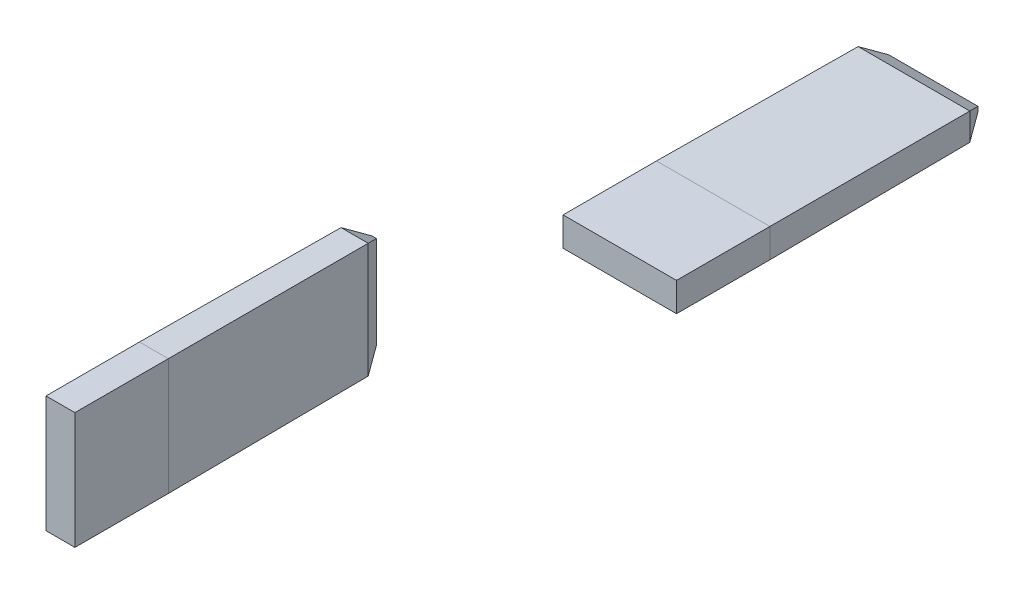
ISO-10303-21;
HEADER;
FILE_DESCRIPTION(('STEP AP214'),'2;1');
FILE_NAME('part.step','',(''),(''),'','','');
FILE_SCHEMA(('AUTOMOTIVE_DESIGN { 1 0 10303 214 1 1 1 1 }'));
ENDSEC;
DATA;
#1=APPLICATION_CONTEXT('core data for automotive mechanical design processes');
#2=APPLICATION_PROTOCOL_DEFINITION('international standard','automotive_design',2000,#1);
#3=PRODUCT_CONTEXT('',#1,'mechanical');
#4=PRODUCT('Part','Part','',(#3));
#5=PRODUCT_RELATED_PRODUCT_CATEGORY('part','',(#4));
#6=PRODUCT_DEFINITION_FORMATION('','',#4);
#7=PRODUCT_DEFINITION_CONTEXT('part definition',#1,'design');
#8=PRODUCT_DEFINITION('design','',#6,#7);
#9=PRODUCT_DEFINITION_SHAPE('','',#8);
#10=(LENGTH_UNIT() NAMED_UNIT(*) SI_UNIT(.MILLI.,.METRE.));
#11=(NAMED_UNIT(*) PLANE_ANGLE_UNIT() SI_UNIT($,.RADIAN.));
#12=(NAMED_UNIT(*) SI_UNIT($,.STERADIAN.) SOLID_ANGLE_UNIT());
#13=UNCERTAINTY_MEASURE_WITH_UNIT(LENGTH_MEASURE(1.E-05),#10,'distance_accuracy_value','');
#14=(GEOMETRIC_REPRESENTATION_CONTEXT(3) GLOBAL_UNCERTAINTY_ASSIGNED_CONTEXT((#13)) GLOBAL_UNIT_ASSIGNED_CONTEXT((#10,
#11,#12)) REPRESENTATION_CONTEXT('',''));
#15=CARTESIAN_POINT('',(0.,0.,0.));
#16=DIRECTION('',(0.,0.,1.));
#17=DIRECTION('',(1.,0.,0.));
#18=AXIS2_PLACEMENT_3D('',#15,#16,#17);
#19=CARTESIAN_POINT('',(0.,39.9999999999999,-9.99999999999999));
#20=DIRECTION('',(0.,-1.,0.));
#21=DIRECTION('',(0.,0.,-1.));
#22=AXIS2_PLACEMENT_3D('',#19,#20,#21);
#23=PLANE('',#22);
#24=DIRECTION('',(1.,0.,0.));
#25=VECTOR('',#24,1.);
#26=CARTESIAN_POINT('',(0.,39.9999999999999,-1.59999999999999));
#27=LINE('',#26,#25);
#28=CARTESIAN_POINT('',(-247.95,39.9999999999999,-1.59999999999999));
#29=VERTEX_POINT('',#28);
#30=CARTESIAN_POINT('',(-237.75,39.9999999999999,-1.59999999999999));
#31=VERTEX_POINT('',#30);
#32=EDGE_CURVE('E156',#29,#31,#27,.T.);
#33=ORIENTED_EDGE('',*,*,#32,.F.);
#34=DIRECTION('',(0.,0.,1.));
#35=VECTOR('',#34,1.);
#36=CARTESIAN_POINT('',(-247.95,39.9999999999999,-9.99999999999999));
#37=LINE('',#36,#35);
#38=CARTESIAN_POINT('',(-247.95,39.9999999999999,-9.99999999999999));
#39=VERTEX_POINT('',#38);
#40=EDGE_CURVE('E142',#39,#29,#37,.T.);
#41=ORIENTED_EDGE('',*,*,#40,.F.);
#42=DIRECTION('',(1.,0.,0.));
#43=VECTOR('',#42,1.);
#44=CARTESIAN_POINT('',(0.,39.9999999999999,-9.99999999999999));
#45=LINE('',#44,#43);
#46=CARTESIAN_POINT('',(-237.75,39.9999999999999,-9.99999999999999));
#47=VERTEX_POINT('',#46);
#48=EDGE_CURVE('E117',#39,#47,#45,.T.);
#49=ORIENTED_EDGE('',*,*,#48,.T.);
#50=DIRECTION('',(0.,0.,1.));
#51=VECTOR('',#50,1.);
#52=CARTESIAN_POINT('',(-237.75,39.9999999999999,-9.99999999999999));
#53=LINE('',#52,#51);
#54=EDGE_CURVE('E132',#47,#31,#53,.T.);
#55=ORIENTED_EDGE('',*,*,#54,.T.);
#56=EDGE_LOOP('',(#33,#41,#49,#55));
#57=FACE_BOUND('',#56,.T.);
#58=ADVANCED_FACE('F45',(#57),#23,.T.);
#59=CARTESIAN_POINT('',(-247.95,3.12500000000002,-9.99999999999999));
#60=DIRECTION('',(-1.,0.,0.));
#61=DIRECTION('',(0.,0.,1.));
#62=AXIS2_PLACEMENT_3D('',#59,#60,#61);
#63=PLANE('',#62);
#64=DIRECTION('',(0.,-1.,0.));
#65=VECTOR('',#64,1.);
#66=CARTESIAN_POINT('',(-247.95,3.12500000000002,-1.59999999999999));
#67=LINE('',#66,#65);
#68=CARTESIAN_POINT('',(-247.95,42.5999999999999,-1.59999999999999));
#69=VERTEX_POINT('',#68);
#70=EDGE_CURVE('E144',#69,#29,#67,.T.);
#71=ORIENTED_EDGE('',*,*,#70,.F.);
#72=DIRECTION('',(0.,0.,1.));
#73=VECTOR('',#72,1.);
#74=CARTESIAN_POINT('',(-247.95,42.5999999999999,-9.99999999999999));
#75=LINE('',#74,#73);
#76=CARTESIAN_POINT('',(-247.95,42.5999999999999,-9.99999999999999));
#77=VERTEX_POINT('',#76);
#78=EDGE_CURVE('E163',#77,#69,#75,.T.);
#79=ORIENTED_EDGE('',*,*,#78,.F.);
#80=DIRECTION('',(0.,-1.,0.));
#81=VECTOR('',#80,1.);
#82=CARTESIAN_POINT('',(-247.95,3.12500000000002,-9.99999999999999));
#83=LINE('',#82,#81);
#84=EDGE_CURVE('E140',#77,#39,#83,.T.);
#85=ORIENTED_EDGE('',*,*,#84,.T.);
#86=ORIENTED_EDGE('',*,*,#40,.T.);
#87=EDGE_LOOP('',(#71,#79,#85,#86));
#88=FACE_BOUND('',#87,.T.);
#89=ADVANCED_FACE('F211',(#88),#63,.T.);
#90=CARTESIAN_POINT('',(0.,42.5999999999999,-9.99999999999999));
#91=DIRECTION('',(0.,1.,0.));
#92=DIRECTION('',(0.,0.,1.));
#93=AXIS2_PLACEMENT_3D('',#90,#91,#92);
#94=PLANE('',#93);
#95=DIRECTION('',(-1.,0.,0.));
#96=VECTOR('',#95,1.);
#97=CARTESIAN_POINT('',(0.,42.5999999999999,-1.59999999999999));
#98=LINE('',#97,#96);
#99=CARTESIAN_POINT('',(-237.75,42.5999999999999,-1.59999999999999));
#100=VERTEX_POINT('',#99);
#101=EDGE_CURVE('E147',#100,#69,#98,.T.);
#102=ORIENTED_EDGE('',*,*,#101,.F.);
#103=DIRECTION('',(0.,0.,1.));
#104=VECTOR('',#103,1.);
#105=CARTESIAN_POINT('',(-237.75,42.5999999999999,-9.99999999999999));
#106=LINE('',#105,#104);
#107=CARTESIAN_POINT('',(-237.75,42.5999999999999,-9.99999999999999));
#108=VERTEX_POINT('',#107);
#109=EDGE_CURVE('E139',#108,#100,#106,.T.);
#110=ORIENTED_EDGE('',*,*,#109,.F.);
#111=DIRECTION('',(-1.,0.,0.));
#112=VECTOR('',#111,1.);
#113=CARTESIAN_POINT('',(0.,42.5999999999999,-9.99999999999999));
#114=LINE('',#113,#112);
#115=EDGE_CURVE('E129',#108,#77,#114,.T.);
#116=ORIENTED_EDGE('',*,*,#115,.T.);
#117=ORIENTED_EDGE('',*,*,#78,.T.);
#118=EDGE_LOOP('',(#102,#110,#116,#117));
#119=FACE_BOUND('',#118,.T.);
#120=ADVANCED_FACE('F216',(#119),#94,.T.);
#121=CARTESIAN_POINT('',(-237.75,3.12500000000002,-9.99999999999999));
#122=DIRECTION('',(1.,0.,0.));
#123=DIRECTION('',(0.,0.,-1.));
#124=AXIS2_PLACEMENT_3D('',#121,#122,#123);
#125=PLANE('',#124);
#126=DIRECTION('',(0.,1.,0.));
#127=VECTOR('',#126,1.);
#128=CARTESIAN_POINT('',(-237.75,3.12500000000002,-1.59999999999999));
#129=LINE('',#128,#127);
#130=EDGE_CURVE('E135',#31,#100,#129,.T.);
#131=ORIENTED_EDGE('',*,*,#130,.F.);
#132=ORIENTED_EDGE('',*,*,#54,.F.);
#133=DIRECTION('',(0.,1.,0.));
#134=VECTOR('',#133,1.);
#135=CARTESIAN_POINT('',(-237.75,3.12500000000002,-9.99999999999999));
#136=LINE('',#135,#134);
#137=EDGE_CURVE('E124',#47,#108,#136,.T.);
#138=ORIENTED_EDGE('',*,*,#137,.T.);
#139=ORIENTED_EDGE('',*,*,#109,.T.);
#140=EDGE_LOOP('',(#131,#132,#138,#139));
#141=FACE_BOUND('',#140,.T.);
#142=ADVANCED_FACE('F133',(#141),#125,.T.);
#143=CARTESIAN_POINT('',(0.,0.,-1.59999999999999));
#144=DIRECTION('',(0.,0.,1.));
#145=DIRECTION('',(0.,-1.,0.));
#146=AXIS2_PLACEMENT_3D('',#143,#144,#145);
#147=PLANE('',#146);
#148=ORIENTED_EDGE('',*,*,#32,.T.);
#149=ORIENTED_EDGE('',*,*,#130,.T.);
#150=ORIENTED_EDGE('',*,*,#101,.T.);
#151=ORIENTED_EDGE('',*,*,#70,.T.);
#152=EDGE_LOOP('',(#148,#149,#150,#151));
#153=FACE_BOUND('',#152,.T.);
#154=ADVANCED_FACE('F232',(#153),#147,.T.);
#155=CARTESIAN_POINT('',(-237.75,0.,-9.99999999999999));
#156=DIRECTION('',(0.999990480720734,0.,-0.00436330928474658));
#157=DIRECTION('',(-0.00436330928474658,0.,-0.999990480720734));
#158=AXIS2_PLACEMENT_3D('',#155,#156,#157);
#159=PLANE('',#158);
#160=DIRECTION('',(0.00436326774997774,-0.00436326774997774,0.999980961713314));
#161=VECTOR('',#160,1.);
#162=CARTESIAN_POINT('',(-237.745473690427,39.9954736904273,-8.96265284213137));
#163=LINE('',#162,#161);
#164=CARTESIAN_POINT('',(-237.828779249498,40.0787792494983,-28.0547594579531));
#165=VERTEX_POINT('',#164);
#166=EDGE_CURVE('E112',#165,#47,#163,.T.);
#167=ORIENTED_EDGE('',*,*,#166,.F.);
#168=DIRECTION('',(0.,1.,0.));
#169=VECTOR('',#168,1.);
#170=CARTESIAN_POINT('',(-237.828779249498,0.,-28.0547594579531));
#171=LINE('',#170,#169);
#172=CARTESIAN_POINT('',(-237.828779249498,42.5212207505015,-28.0547594579531));
#173=VERTEX_POINT('',#172);
#174=EDGE_CURVE('E70',#165,#173,#171,.T.);
#175=ORIENTED_EDGE('',*,*,#174,.T.);
#176=DIRECTION('',(0.00436326774997774,0.00436326774997774,0.999980961713314));
#177=VECTOR('',#176,1.);
#178=CARTESIAN_POINT('',(-237.750811023292,42.5991889767074,-10.1858716674036));
#179=LINE('',#178,#177);
#180=EDGE_CURVE('E121',#173,#108,#179,.T.);
#181=ORIENTED_EDGE('',*,*,#180,.T.);
#182=ORIENTED_EDGE('',*,*,#137,.F.);
#183=EDGE_LOOP('',(#167,#175,#181,#182));
#184=FACE_BOUND('',#183,.T.);
#185=ADVANCED_FACE('F126',(#184),#159,.T.);
#186=CARTESIAN_POINT('',(0.,42.5999999999999,-9.99999999999999));
#187=DIRECTION('',(0.,0.999990480720734,-0.00436330928474658));
#188=DIRECTION('',(0.,0.00436330928474658,0.999990480720734));
#189=AXIS2_PLACEMENT_3D('',#186,#187,#188);
#190=PLANE('',#189);
#191=ORIENTED_EDGE('',*,*,#180,.F.);
#192=DIRECTION('',(-1.,0.,0.));
#193=VECTOR('',#192,1.);
#194=CARTESIAN_POINT('',(0.,42.5212207505015,-28.0547594579531));
#195=LINE('',#194,#193);
#196=CARTESIAN_POINT('',(-247.871220750501,42.5212207505015,-28.0547594579531));
#197=VERTEX_POINT('',#196);
#198=EDGE_CURVE('E55',#173,#197,#195,.T.);
#199=ORIENTED_EDGE('',*,*,#198,.T.);
#200=DIRECTION('',(-0.00436326774997774,0.00436326774997774,0.999980961713314));
#201=VECTOR('',#200,1.);
#202=CARTESIAN_POINT('',(-247.945279501751,42.5952795017516,-11.0818516416131));
#203=LINE('',#202,#201);
#204=EDGE_CURVE('E150',#197,#77,#203,.T.);
#205=ORIENTED_EDGE('',*,*,#204,.T.);
#206=ORIENTED_EDGE('',*,*,#115,.F.);
#207=EDGE_LOOP('',(#191,#199,#205,#206));
#208=FACE_BOUND('',#207,.T.);
#209=ADVANCED_FACE('F242',(#208),#190,.T.);
#210=CARTESIAN_POINT('',(-247.95,0.,-9.99999999999999));
#211=DIRECTION('',(-0.999990480720734,0.,-0.00436330928474658));
#212=DIRECTION('',(-0.00436330928474658,0.,0.999990480720734));
#213=AXIS2_PLACEMENT_3D('',#210,#211,#212);
#214=PLANE('',#213);
#215=ORIENTED_EDGE('',*,*,#204,.F.);
#216=DIRECTION('',(0.,-1.,0.));
#217=VECTOR('',#216,1.);
#218=CARTESIAN_POINT('',(-247.871220750501,0.,-28.0547594579531));
#219=LINE('',#218,#217);
#220=CARTESIAN_POINT('',(-247.871220750501,40.0787792494983,-28.0547594579531));
#221=VERTEX_POINT('',#220);
#222=EDGE_CURVE('E12',#197,#221,#219,.T.);
#223=ORIENTED_EDGE('',*,*,#222,.T.);
#224=DIRECTION('',(-0.00436326774997774,-0.00436326774997774,0.999980961713314));
#225=VECTOR('',#224,1.);
#226=CARTESIAN_POINT('',(-247.950761524218,39.9992384757816,-9.82547261276658));
#227=LINE('',#226,#225);
#228=EDGE_CURVE('E158',#221,#39,#227,.T.);
#229=ORIENTED_EDGE('',*,*,#228,.T.);
#230=ORIENTED_EDGE('',*,*,#84,.F.);
#231=EDGE_LOOP('',(#215,#223,#229,#230));
#232=FACE_BOUND('',#231,.T.);
#233=ADVANCED_FACE('F239',(#232),#214,.T.);
#234=CARTESIAN_POINT('',(0.,39.9999999999999,-9.99999999999999));
#235=DIRECTION('',(0.,-0.999990480720734,-0.00436330928474658));
#236=DIRECTION('',(0.,0.00436330928474658,-0.999990480720734));
#237=AXIS2_PLACEMENT_3D('',#234,#235,#236);
#238=PLANE('',#237);
#239=ORIENTED_EDGE('',*,*,#228,.F.);
#240=DIRECTION('',(1.,0.,0.));
#241=VECTOR('',#240,1.);
#242=CARTESIAN_POINT('',(0.,40.0787792494983,-28.0547594579531));
#243=LINE('',#242,#241);
#244=EDGE_CURVE('E120',#221,#165,#243,.T.);
#245=ORIENTED_EDGE('',*,*,#244,.T.);
#246=ORIENTED_EDGE('',*,*,#166,.T.);
#247=ORIENTED_EDGE('',*,*,#48,.F.);
#248=EDGE_LOOP('',(#239,#245,#246,#247));
#249=FACE_BOUND('',#248,.T.);
#250=ADVANCED_FACE('F115',(#249),#238,.T.);
#251=CARTESIAN_POINT('',(-248.45,47.9999999999999,-29.8));
#252=DIRECTION('',(0.,0.,-1.));
#253=DIRECTION('',(0.,-1.,0.));
#254=AXIS2_PLACEMENT_3D('',#251,#252,#253);
#255=PLANE('',#254);
#256=DIRECTION('',(0.,-1.,0.));
#257=VECTOR('',#256,1.);
#258=CARTESIAN_POINT('',(-238.83639434625,47.9999999999999,-29.8));
#259=LINE('',#258,#257);
#260=CARTESIAN_POINT('',(-238.83639434625,41.51360565375,-29.8));
#261=VERTEX_POINT('',#260);
#262=CARTESIAN_POINT('',(-238.83639434625,41.0863943462498,-29.8));
#263=VERTEX_POINT('',#262);
#264=EDGE_CURVE('E171',#261,#263,#259,.T.);
#265=ORIENTED_EDGE('',*,*,#264,.T.);
#266=DIRECTION('',(-1.,0.,0.));
#267=VECTOR('',#266,1.);
#268=CARTESIAN_POINT('',(-248.45,41.0863943462498,-29.8));
#269=LINE('',#268,#267);
#270=CARTESIAN_POINT('',(-246.86360565375,41.0863943462498,-29.8));
#271=VERTEX_POINT('',#270);
#272=EDGE_CURVE('E173',#263,#271,#269,.T.);
#273=ORIENTED_EDGE('',*,*,#272,.T.);
#274=DIRECTION('',(0.,1.,0.));
#275=VECTOR('',#274,1.);
#276=CARTESIAN_POINT('',(-246.86360565375,47.9999999999999,-29.8));
#277=LINE('',#276,#275);
#278=CARTESIAN_POINT('',(-246.86360565375,41.51360565375,-29.8));
#279=VERTEX_POINT('',#278);
#280=EDGE_CURVE('E167',#271,#279,#277,.T.);
#281=ORIENTED_EDGE('',*,*,#280,.T.);
#282=DIRECTION('',(1.,0.,0.));
#283=VECTOR('',#282,1.);
#284=CARTESIAN_POINT('',(-248.45,41.51360565375,-29.8));
#285=LINE('',#284,#283);
#286=EDGE_CURVE('E169',#279,#261,#285,.T.);
#287=ORIENTED_EDGE('',*,*,#286,.T.);
#288=EDGE_LOOP('',(#265,#273,#281,#287));
#289=FACE_BOUND('',#288,.T.);
#290=ADVANCED_FACE('F196',(#289),#255,.T.);
#291=CARTESIAN_POINT('',(0.,42.5212207505015,-28.0547594579531));
#292=DIRECTION('',(0.,-0.866025403784435,0.500000000000007));
#293=DIRECTION('',(-1.,0.,0.));
#294=AXIS2_PLACEMENT_3D('',#291,#292,#293);
#295=PLANE('',#294);
#296=DIRECTION('',(-0.447213595499963,-0.447213595499963,-0.774596669241478));
#297=VECTOR('',#296,1.);
#298=CARTESIAN_POINT('',(-190.263023399597,90.0869766004021,54.33154637449));
#299=LINE('',#298,#297);
#300=EDGE_CURVE('E181',#261,#173,#299,.F.);
#301=ORIENTED_EDGE('',*,*,#300,.F.);
#302=ORIENTED_EDGE('',*,*,#286,.F.);
#303=DIRECTION('',(0.447213595499963,-0.447213595499963,-0.774596669241478));
#304=VECTOR('',#303,1.);
#305=CARTESIAN_POINT('',(-239.366976600401,34.016976600401,-42.7845424058972));
#306=LINE('',#305,#304);
#307=EDGE_CURVE('E50',#197,#279,#306,.T.);
#308=ORIENTED_EDGE('',*,*,#307,.F.);
#309=ORIENTED_EDGE('',*,*,#198,.F.);
#310=EDGE_LOOP('',(#301,#302,#308,#309));
#311=FACE_BOUND('',#310,.T.);
#312=ADVANCED_FACE('F48',(#311),#295,.F.);
#313=CARTESIAN_POINT('',(-247.871220750501,0.,-28.0547594579531));
#314=DIRECTION('',(0.866025403784435,0.,0.500000000000007));
#315=DIRECTION('',(0.,-1.,0.));
#316=AXIS2_PLACEMENT_3D('',#313,#314,#315);
#317=PLANE('',#316);
#318=ORIENTED_EDGE('',*,*,#307,.T.);
#319=ORIENTED_EDGE('',*,*,#280,.F.);
#320=DIRECTION('',(-0.447213595499963,-0.447213595499963,0.774596669241478));
#321=VECTOR('',#320,1.);
#322=CARTESIAN_POINT('',(-255.886976600401,32.0630233995985,-14.1710630648594));
#323=LINE('',#322,#321);
#324=EDGE_CURVE('E180',#221,#271,#323,.F.);
#325=ORIENTED_EDGE('',*,*,#324,.F.);
#326=ORIENTED_EDGE('',*,*,#222,.F.);
#327=EDGE_LOOP('',(#318,#319,#325,#326));
#328=FACE_BOUND('',#327,.T.);
#329=ADVANCED_FACE('F191',(#328),#317,.F.);
#330=CARTESIAN_POINT('',(-237.828779249498,0.,-28.0547594579531));
#331=DIRECTION('',(-0.866025403784435,0.,0.500000000000007));
#332=DIRECTION('',(0.,1.,0.));
#333=AXIS2_PLACEMENT_3D('',#330,#331,#332);
#334=PLANE('',#333);
#335=ORIENTED_EDGE('',*,*,#300,.T.);
#336=ORIENTED_EDGE('',*,*,#174,.F.);
#337=DIRECTION('',(-0.447213595499963,0.447213595499963,-0.774596669241478));
#338=VECTOR('',#337,1.);
#339=CARTESIAN_POINT('',(-229.813023399598,32.0630233995985,-14.1710630648594));
#340=LINE('',#339,#338);
#341=EDGE_CURVE('E178',#263,#165,#340,.F.);
#342=ORIENTED_EDGE('',*,*,#341,.F.);
#343=ORIENTED_EDGE('',*,*,#264,.F.);
#344=EDGE_LOOP('',(#335,#336,#342,#343));
#345=FACE_BOUND('',#344,.T.);
#346=ADVANCED_FACE('F201',(#345),#334,.F.);
#347=CARTESIAN_POINT('',(0.,40.0787792494983,-28.0547594579531));
#348=DIRECTION('',(0.,0.866025403784435,0.500000000000007));
#349=DIRECTION('',(1.,0.,0.));
#350=AXIS2_PLACEMENT_3D('',#347,#348,#349);
#351=PLANE('',#350);
#352=ORIENTED_EDGE('',*,*,#324,.T.);
#353=ORIENTED_EDGE('',*,*,#272,.F.);
#354=ORIENTED_EDGE('',*,*,#341,.T.);
#355=ORIENTED_EDGE('',*,*,#244,.F.);
#356=EDGE_LOOP('',(#352,#353,#354,#355));
#357=FACE_BOUND('',#356,.T.);
#358=ADVANCED_FACE('F200',(#357),#351,.F.);
#359=CLOSED_SHELL('',(#58,#89,#120,#142,#154,#185,#209,#233,#250,#290,#312,#329,#346,#358));
#360=MANIFOLD_SOLID_BREP('B2',#359);
#361=CARTESIAN_POINT('',(-294.45,3.12500000000002,-9.99999999999999));
#362=DIRECTION('',(-1.,0.,0.));
#363=DIRECTION('',(0.,0.,1.));
#364=AXIS2_PLACEMENT_3D('',#361,#362,#363);
#365=PLANE('',#364);
#366=DIRECTION('',(0.,-1.,0.));
#367=VECTOR('',#366,1.);
#368=CARTESIAN_POINT('',(-294.45,3.12500000000002,-1.59999999999999));
#369=LINE('',#368,#367);
#370=CARTESIAN_POINT('',(-294.45,5.25,-1.59999999999999));
#371=VERTEX_POINT('',#370);
#372=CARTESIAN_POINT('',(-294.45,-5.25,-1.59999999999999));
#373=VERTEX_POINT('',#372);
#374=EDGE_CURVE('E430',#371,#373,#369,.T.);
#375=ORIENTED_EDGE('',*,*,#374,.F.);
#376=DIRECTION('',(0.,0.,1.));
#377=VECTOR('',#376,1.);
#378=CARTESIAN_POINT('',(-294.45,5.25,-9.99999999999999));
#379=LINE('',#378,#377);
#380=CARTESIAN_POINT('',(-294.45,5.25,-9.99999999999999));
#381=VERTEX_POINT('',#380);
#382=EDGE_CURVE('E428',#381,#371,#379,.T.);
#383=ORIENTED_EDGE('',*,*,#382,.F.);
#384=DIRECTION('',(0.,-1.,0.));
#385=VECTOR('',#384,1.);
#386=CARTESIAN_POINT('',(-294.45,3.12500000000002,-9.99999999999999));
#387=LINE('',#386,#385);
#388=CARTESIAN_POINT('',(-294.45,-5.25,-9.99999999999999));
#389=VERTEX_POINT('',#388);
#390=EDGE_CURVE('E418',#381,#389,#387,.T.);
#391=ORIENTED_EDGE('',*,*,#390,.T.);
#392=DIRECTION('',(0.,0.,1.));
#393=VECTOR('',#392,1.);
#394=CARTESIAN_POINT('',(-294.45,-5.25,-9.99999999999999));
#395=LINE('',#394,#393);
#396=EDGE_CURVE('E439',#389,#373,#395,.T.);
#397=ORIENTED_EDGE('',*,*,#396,.T.);
#398=EDGE_LOOP('',(#375,#383,#391,#397));
#399=FACE_BOUND('',#398,.T.);
#400=ADVANCED_FACE('F341',(#399),#365,.T.);
#401=CARTESIAN_POINT('',(0.,5.25,-9.99999999999999));
#402=DIRECTION('',(0.,1.,0.));
#403=DIRECTION('',(0.,0.,1.));
#404=AXIS2_PLACEMENT_3D('',#401,#402,#403);
#405=PLANE('',#404);
#406=DIRECTION('',(-1.,0.,0.));
#407=VECTOR('',#406,1.);
#408=CARTESIAN_POINT('',(0.,5.25,-1.59999999999999));
#409=LINE('',#408,#407);
#410=CARTESIAN_POINT('',(-291.85,5.25,-1.59999999999999));
#411=VERTEX_POINT('',#410);
#412=EDGE_CURVE('E425',#411,#371,#409,.T.);
#413=ORIENTED_EDGE('',*,*,#412,.F.);
#414=DIRECTION('',(0.,0.,1.));
#415=VECTOR('',#414,1.);
#416=CARTESIAN_POINT('',(-291.85,5.25,-9.99999999999999));
#417=LINE('',#416,#415);
#418=CARTESIAN_POINT('',(-291.85,5.25,-9.99999999999999));
#419=VERTEX_POINT('',#418);
#420=EDGE_CURVE('E435',#419,#411,#417,.T.);
#421=ORIENTED_EDGE('',*,*,#420,.F.);
#422=DIRECTION('',(-1.,0.,0.));
#423=VECTOR('',#422,1.);
#424=CARTESIAN_POINT('',(0.,5.25,-9.99999999999999));
#425=LINE('',#424,#423);
#426=EDGE_CURVE('E410',#419,#381,#425,.T.);
#427=ORIENTED_EDGE('',*,*,#426,.T.);
#428=ORIENTED_EDGE('',*,*,#382,.T.);
#429=EDGE_LOOP('',(#413,#421,#427,#428));
#430=FACE_BOUND('',#429,.T.);
#431=ADVANCED_FACE('F437',(#430),#405,.T.);
#432=CARTESIAN_POINT('',(-291.85,3.12500000000002,-9.99999999999999));
#433=DIRECTION('',(1.,0.,0.));
#434=DIRECTION('',(0.,0.,-1.));
#435=AXIS2_PLACEMENT_3D('',#432,#433,#434);
#436=PLANE('',#435);
#437=DIRECTION('',(0.,1.,0.));
#438=VECTOR('',#437,1.);
#439=CARTESIAN_POINT('',(-291.85,3.12500000000002,-1.59999999999999));
#440=LINE('',#439,#438);
#441=CARTESIAN_POINT('',(-291.85,-5.25,-1.59999999999999));
#442=VERTEX_POINT('',#441);
#443=EDGE_CURVE('E451',#442,#411,#440,.T.);
#444=ORIENTED_EDGE('',*,*,#443,.F.);
#445=DIRECTION('',(0.,0.,1.));
#446=VECTOR('',#445,1.);
#447=CARTESIAN_POINT('',(-291.85,-5.25,-9.99999999999999));
#448=LINE('',#447,#446);
#449=CARTESIAN_POINT('',(-291.85,-5.25,-9.99999999999999));
#450=VERTEX_POINT('',#449);
#451=EDGE_CURVE('E442',#450,#442,#448,.T.);
#452=ORIENTED_EDGE('',*,*,#451,.F.);
#453=DIRECTION('',(0.,1.,0.));
#454=VECTOR('',#453,1.);
#455=CARTESIAN_POINT('',(-291.85,3.12500000000002,-9.99999999999999));
#456=LINE('',#455,#454);
#457=EDGE_CURVE('E440',#450,#419,#456,.T.);
#458=ORIENTED_EDGE('',*,*,#457,.T.);
#459=ORIENTED_EDGE('',*,*,#420,.T.);
#460=EDGE_LOOP('',(#444,#452,#458,#459));
#461=FACE_BOUND('',#460,.T.);
#462=ADVANCED_FACE('F517',(#461),#436,.T.);
#463=CARTESIAN_POINT('',(0.,-5.25,-9.99999999999999));
#464=DIRECTION('',(0.,-1.,0.));
#465=DIRECTION('',(0.,0.,-1.));
#466=AXIS2_PLACEMENT_3D('',#463,#464,#465);
#467=PLANE('',#466);
#468=DIRECTION('',(1.,0.,0.));
#469=VECTOR('',#468,1.);
#470=CARTESIAN_POINT('',(0.,-5.25,-1.59999999999999));
#471=LINE('',#470,#469);
#472=EDGE_CURVE('E448',#373,#442,#471,.T.);
#473=ORIENTED_EDGE('',*,*,#472,.F.);
#474=ORIENTED_EDGE('',*,*,#396,.F.);
#475=DIRECTION('',(1.,0.,0.));
#476=VECTOR('',#475,1.);
#477=CARTESIAN_POINT('',(0.,-5.25,-9.99999999999999));
#478=LINE('',#477,#476);
#479=EDGE_CURVE('E424',#389,#450,#478,.T.);
#480=ORIENTED_EDGE('',*,*,#479,.T.);
#481=ORIENTED_EDGE('',*,*,#451,.T.);
#482=EDGE_LOOP('',(#473,#474,#480,#481));
#483=FACE_BOUND('',#482,.T.);
#484=ADVANCED_FACE('F492',(#483),#467,.T.);
#485=CARTESIAN_POINT('',(0.,0.,-1.59999999999999));
#486=DIRECTION('',(0.,0.,1.));
#487=DIRECTION('',(0.,-1.,0.));
#488=AXIS2_PLACEMENT_3D('',#485,#486,#487);
#489=PLANE('',#488);
#490=ORIENTED_EDGE('',*,*,#374,.T.);
#491=ORIENTED_EDGE('',*,*,#472,.T.);
#492=ORIENTED_EDGE('',*,*,#443,.T.);
#493=ORIENTED_EDGE('',*,*,#412,.T.);
#494=EDGE_LOOP('',(#490,#491,#492,#493));
#495=FACE_BOUND('',#494,.T.);
#496=ADVANCED_FACE('F532',(#495),#489,.T.);
#497=CARTESIAN_POINT('',(-248.45,47.9999999999999,-29.8));
#498=DIRECTION('',(0.,0.,-1.));
#499=DIRECTION('',(0.,-1.,0.));
#500=AXIS2_PLACEMENT_3D('',#497,#498,#499);
#501=PLANE('',#500);
#502=DIRECTION('',(0.,-1.,0.));
#503=VECTOR('',#502,1.);
#504=CARTESIAN_POINT('',(-292.93639434625,47.9999999999999,-29.8));
#505=LINE('',#504,#503);
#506=CARTESIAN_POINT('',(-292.93639434625,4.16360565375006,-29.8));
#507=VERTEX_POINT('',#506);
#508=CARTESIAN_POINT('',(-292.93639434625,-4.16360565375005,-29.8));
#509=VERTEX_POINT('',#508);
#510=EDGE_CURVE('E463',#507,#509,#505,.T.);
#511=ORIENTED_EDGE('',*,*,#510,.T.);
#512=DIRECTION('',(-1.,0.,0.));
#513=VECTOR('',#512,1.);
#514=CARTESIAN_POINT('',(-248.45,-4.16360565375005,-29.8));
#515=LINE('',#514,#513);
#516=CARTESIAN_POINT('',(-293.36360565375,-4.16360565375005,-29.8));
#517=VERTEX_POINT('',#516);
#518=EDGE_CURVE('E465',#509,#517,#515,.T.);
#519=ORIENTED_EDGE('',*,*,#518,.T.);
#520=DIRECTION('',(0.,1.,0.));
#521=VECTOR('',#520,1.);
#522=CARTESIAN_POINT('',(-293.36360565375,47.9999999999999,-29.8));
#523=LINE('',#522,#521);
#524=CARTESIAN_POINT('',(-293.36360565375,4.16360565375006,-29.8));
#525=VERTEX_POINT('',#524);
#526=EDGE_CURVE('E459',#517,#525,#523,.T.);
#527=ORIENTED_EDGE('',*,*,#526,.T.);
#528=DIRECTION('',(1.,0.,0.));
#529=VECTOR('',#528,1.);
#530=CARTESIAN_POINT('',(-248.45,4.16360565375005,-29.8));
#531=LINE('',#530,#529);
#532=EDGE_CURVE('E461',#525,#507,#531,.T.);
#533=ORIENTED_EDGE('',*,*,#532,.T.);
#534=EDGE_LOOP('',(#511,#519,#527,#533));
#535=FACE_BOUND('',#534,.T.);
#536=ADVANCED_FACE('F538',(#535),#501,.T.);
#537=CARTESIAN_POINT('',(0.,-5.25,-9.99999999999999));
#538=DIRECTION('',(0.,-0.999990480720734,-0.00436330928474658));
#539=DIRECTION('',(0.,0.00436330928474658,-0.999990480720734));
#540=AXIS2_PLACEMENT_3D('',#537,#538,#539);
#541=PLANE('',#540);
#542=DIRECTION('',(-0.00436326774997774,-0.00436326774997774,0.999980961713314));
#543=VECTOR('',#542,1.);
#544=CARTESIAN_POINT('',(-294.449900049946,-5.24990004994635,-10.0229067195744));
#545=LINE('',#544,#543);
#546=CARTESIAN_POINT('',(-294.371220750501,-5.17122075050157,-28.0547594579529));
#547=VERTEX_POINT('',#546);
#548=EDGE_CURVE('E414',#547,#389,#545,.T.);
#549=ORIENTED_EDGE('',*,*,#548,.F.);
#550=DIRECTION('',(1.,0.,0.));
#551=VECTOR('',#550,1.);
#552=CARTESIAN_POINT('',(0.,-5.17122075050157,-28.054759457953));
#553=LINE('',#552,#551);
#554=CARTESIAN_POINT('',(-291.928779249498,-5.17122075050157,-28.0547594579529));
#555=VERTEX_POINT('',#554);
#556=EDGE_CURVE('E434',#547,#555,#553,.T.);
#557=ORIENTED_EDGE('',*,*,#556,.T.);
#558=DIRECTION('',(0.00436326774997774,-0.00436326774997774,0.999980961713314));
#559=VECTOR('',#558,1.);
#560=CARTESIAN_POINT('',(-291.844443728922,-5.25555627107792,-8.72660455089818));
#561=LINE('',#560,#559);
#562=EDGE_CURVE('E479',#555,#450,#561,.T.);
#563=ORIENTED_EDGE('',*,*,#562,.T.);
#564=ORIENTED_EDGE('',*,*,#479,.F.);
#565=EDGE_LOOP('',(#549,#557,#563,#564));
#566=FACE_BOUND('',#565,.T.);
#567=ADVANCED_FACE('F495',(#566),#541,.T.);
#568=CARTESIAN_POINT('',(-291.85,0.,-9.99999999999999));
#569=DIRECTION('',(0.999990480720734,0.,-0.00436330928474658));
#570=DIRECTION('',(-0.00436330928474658,0.,-0.999990480720734));
#571=AXIS2_PLACEMENT_3D('',#568,#569,#570);
#572=PLANE('',#571);
#573=ORIENTED_EDGE('',*,*,#562,.F.);
#574=DIRECTION('',(0.,1.,0.));
#575=VECTOR('',#574,1.);
#576=CARTESIAN_POINT('',(-291.928779249498,0.,-28.0547594579529));
#577=LINE('',#576,#575);
#578=CARTESIAN_POINT('',(-291.928779249498,5.17122075050157,-28.054759457953));
#579=VERTEX_POINT('',#578);
#580=EDGE_CURVE('E366',#555,#579,#577,.T.);
#581=ORIENTED_EDGE('',*,*,#580,.T.);
#582=DIRECTION('',(0.00436326774997774,0.00436326774997774,0.999980961713314));
#583=VECTOR('',#582,1.);
#584=CARTESIAN_POINT('',(-291.850099950053,5.24990004994635,-10.0229067195744));
#585=LINE('',#584,#583);
#586=EDGE_CURVE('E415',#579,#419,#585,.T.);
#587=ORIENTED_EDGE('',*,*,#586,.T.);
#588=ORIENTED_EDGE('',*,*,#457,.F.);
#589=EDGE_LOOP('',(#573,#581,#587,#588));
#590=FACE_BOUND('',#589,.T.);
#591=ADVANCED_FACE('F545',(#590),#572,.T.);
#592=CARTESIAN_POINT('',(0.,5.25,-9.99999999999999));
#593=DIRECTION('',(0.,0.999990480720734,-0.00436330928474658));
#594=DIRECTION('',(0.,0.00436330928474658,0.999990480720734));
#595=AXIS2_PLACEMENT_3D('',#592,#593,#594);
#596=PLANE('',#595);
#597=ORIENTED_EDGE('',*,*,#586,.F.);
#598=DIRECTION('',(-1.,0.,0.));
#599=VECTOR('',#598,1.);
#600=CARTESIAN_POINT('',(0.,5.17122075050157,-28.054759457953));
#601=LINE('',#600,#599);
#602=CARTESIAN_POINT('',(-294.371220750501,5.17122075050157,-28.0547594579529));
#603=VERTEX_POINT('',#602);
#604=EDGE_CURVE('E351',#579,#603,#601,.T.);
#605=ORIENTED_EDGE('',*,*,#604,.T.);
#606=DIRECTION('',(-0.00436326774997774,0.00436326774997774,0.999980961713314));
#607=VECTOR('',#606,1.);
#608=CARTESIAN_POINT('',(-294.444394229848,5.24439422984789,-11.284739729272));
#609=LINE('',#608,#607);
#610=EDGE_CURVE('E406',#603,#381,#609,.T.);
#611=ORIENTED_EDGE('',*,*,#610,.T.);
#612=ORIENTED_EDGE('',*,*,#426,.F.);
#613=EDGE_LOOP('',(#597,#605,#611,#612));
#614=FACE_BOUND('',#613,.T.);
#615=ADVANCED_FACE('F408',(#614),#596,.T.);
#616=CARTESIAN_POINT('',(-294.45,0.,-9.99999999999999));
#617=DIRECTION('',(-0.999990480720734,0.,-0.00436330928474658));
#618=DIRECTION('',(-0.00436330928474658,0.,0.999990480720734));
#619=AXIS2_PLACEMENT_3D('',#616,#617,#618);
#620=PLANE('',#619);
#621=ORIENTED_EDGE('',*,*,#610,.F.);
#622=DIRECTION('',(0.,-1.,0.));
#623=VECTOR('',#622,1.);
#624=CARTESIAN_POINT('',(-294.371220750501,0.,-28.0547594579529));
#625=LINE('',#624,#623);
#626=EDGE_CURVE('E43',#603,#547,#625,.T.);
#627=ORIENTED_EDGE('',*,*,#626,.T.);
#628=ORIENTED_EDGE('',*,*,#548,.T.);
#629=ORIENTED_EDGE('',*,*,#390,.F.);
#630=EDGE_LOOP('',(#621,#627,#628,#629));
#631=FACE_BOUND('',#630,.T.);
#632=ADVANCED_FACE('F420',(#631),#620,.T.);
#633=CARTESIAN_POINT('',(0.,5.17122075050157,-28.054759457953));
#634=DIRECTION('',(0.,-0.866025403784435,0.500000000000006));
#635=DIRECTION('',(-1.,0.,0.));
#636=AXIS2_PLACEMENT_3D('',#633,#634,#635);
#637=PLANE('',#636);
#638=DIRECTION('',(-0.44721359549996,-0.447213595499962,-0.77459666924148));
#639=VECTOR('',#638,1.);
#640=CARTESIAN_POINT('',(-233.543023399598,63.5569766004021,73.072336112385));
#641=LINE('',#640,#639);
#642=EDGE_CURVE('E473',#507,#579,#641,.F.);
#643=ORIENTED_EDGE('',*,*,#642,.F.);
#644=ORIENTED_EDGE('',*,*,#532,.F.);
#645=DIRECTION('',(0.44721359549996,-0.447213595499962,-0.77459666924148));
#646=VECTOR('',#645,1.);
#647=CARTESIAN_POINT('',(-293.336976600401,4.13697660040124,-29.8461228733576));
#648=LINE('',#647,#646);
#649=EDGE_CURVE('E346',#603,#525,#648,.T.);
#650=ORIENTED_EDGE('',*,*,#649,.F.);
#651=ORIENTED_EDGE('',*,*,#604,.F.);
#652=EDGE_LOOP('',(#643,#644,#650,#651));
#653=FACE_BOUND('',#652,.T.);
#654=ADVANCED_FACE('F344',(#653),#637,.F.);
#655=CARTESIAN_POINT('',(-294.371220750501,0.,-28.054759457953));
#656=DIRECTION('',(0.866025403784436,0.,0.500000000000004));
#657=DIRECTION('',(0.,-1.,0.));
#658=AXIS2_PLACEMENT_3D('',#655,#656,#657);
#659=PLANE('',#658);
#660=ORIENTED_EDGE('',*,*,#649,.T.);
#661=ORIENTED_EDGE('',*,*,#526,.F.);
#662=DIRECTION('',(-0.44721359549996,-0.447213595499962,0.77459666924148));
#663=VECTOR('',#662,1.);
#664=CARTESIAN_POINT('',(-293.336976600401,-4.13697660040124,-29.8461228733576));
#665=LINE('',#664,#663);
#666=EDGE_CURVE('E472',#547,#517,#665,.F.);
#667=ORIENTED_EDGE('',*,*,#666,.F.);
#668=ORIENTED_EDGE('',*,*,#626,.F.);
#669=EDGE_LOOP('',(#660,#661,#667,#668));
#670=FACE_BOUND('',#669,.T.);
#671=ADVANCED_FACE('F498',(#670),#659,.F.);
#672=CARTESIAN_POINT('',(-291.928779249498,0.,-28.054759457953));
#673=DIRECTION('',(-0.866025403784436,0.,0.500000000000004));
#674=DIRECTION('',(0.,1.,0.));
#675=AXIS2_PLACEMENT_3D('',#672,#673,#674);
#676=PLANE('',#675);
#677=ORIENTED_EDGE('',*,*,#642,.T.);
#678=ORIENTED_EDGE('',*,*,#580,.F.);
#679=DIRECTION('',(-0.44721359549996,0.447213595499962,-0.77459666924148));
#680=VECTOR('',#679,1.);
#681=CARTESIAN_POINT('',(-292.963023399599,-4.13697660040124,-29.8461228733576));
#682=LINE('',#681,#680);
#683=EDGE_CURVE('E470',#509,#555,#682,.F.);
#684=ORIENTED_EDGE('',*,*,#683,.F.);
#685=ORIENTED_EDGE('',*,*,#510,.F.);
#686=EDGE_LOOP('',(#677,#678,#684,#685));
#687=FACE_BOUND('',#686,.T.);
#688=ADVANCED_FACE('F503',(#687),#676,.F.);
#689=CARTESIAN_POINT('',(0.,-5.17122075050157,-28.054759457953));
#690=DIRECTION('',(0.,0.866025403784436,0.500000000000005));
#691=DIRECTION('',(1.,0.,0.));
#692=AXIS2_PLACEMENT_3D('',#689,#690,#691);
#693=PLANE('',#692);
#694=ORIENTED_EDGE('',*,*,#666,.T.);
#695=ORIENTED_EDGE('',*,*,#518,.F.);
#696=ORIENTED_EDGE('',*,*,#683,.T.);
#697=ORIENTED_EDGE('',*,*,#556,.F.);
#698=EDGE_LOOP('',(#694,#695,#696,#697));
#699=FACE_BOUND('',#698,.T.);
#700=ADVANCED_FACE('F501',(#699),#693,.F.);
#701=CLOSED_SHELL('',(#400,#431,#462,#484,#496,#536,#567,#591,#615,#632,#654,#671,#688,#700));
#702=MANIFOLD_SOLID_BREP('B6',#701);
#703=ADVANCED_BREP_SHAPE_REPRESENTATION('',(#18,#360,#702),#14);
#704=SHAPE_DEFINITION_REPRESENTATION(#9,#703);
ENDSEC;
END-ISO-10303-21;
